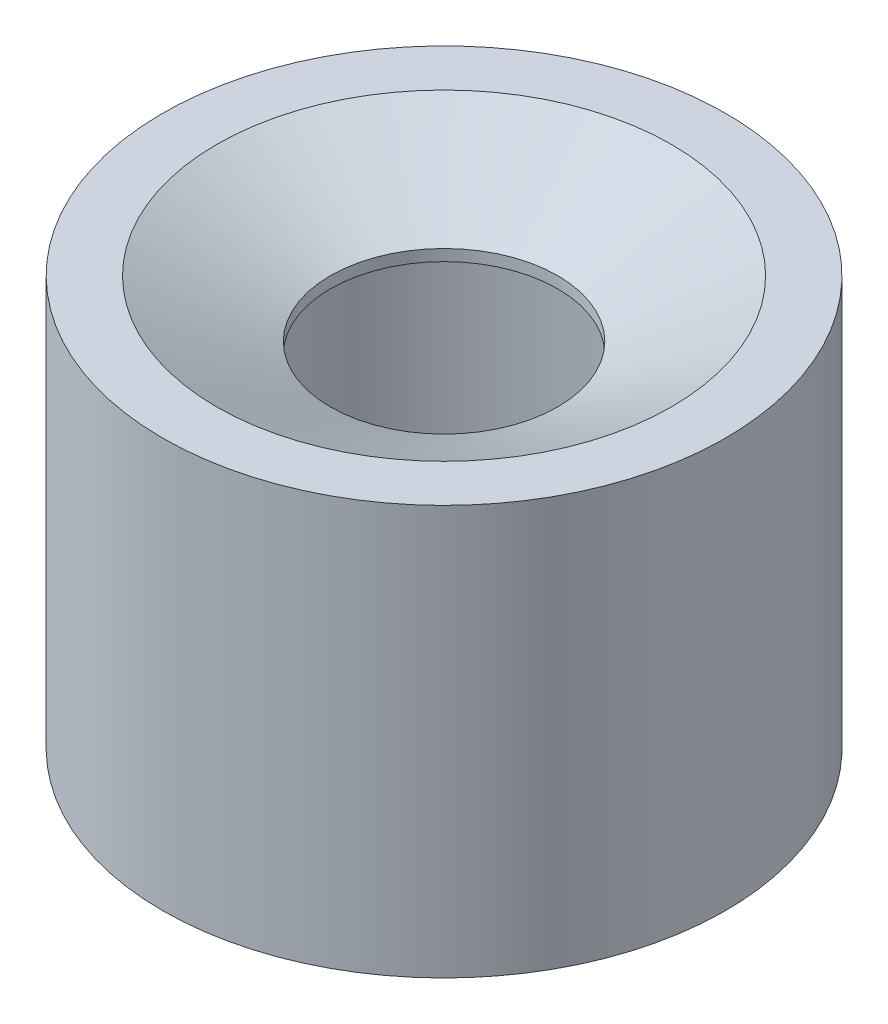
ISO-10303-21;
HEADER;
FILE_DESCRIPTION(('STEP AP214'),'2;1');
FILE_NAME('part.step','',(''),(''),'','','');
FILE_SCHEMA(('AUTOMOTIVE_DESIGN { 1 0 10303 214 1 1 1 1 }'));
ENDSEC;
DATA;
#1=APPLICATION_CONTEXT('core data for automotive mechanical design processes');
#2=APPLICATION_PROTOCOL_DEFINITION('international standard','automotive_design',2000,#1);
#3=PRODUCT_CONTEXT('',#1,'mechanical');
#4=PRODUCT('Part','Part','',(#3));
#5=PRODUCT_RELATED_PRODUCT_CATEGORY('part','',(#4));
#6=PRODUCT_DEFINITION_FORMATION('','',#4);
#7=PRODUCT_DEFINITION_CONTEXT('part definition',#1,'design');
#8=PRODUCT_DEFINITION('design','',#6,#7);
#9=PRODUCT_DEFINITION_SHAPE('','',#8);
#10=(LENGTH_UNIT() NAMED_UNIT(*) SI_UNIT(.MILLI.,.METRE.));
#11=(NAMED_UNIT(*) PLANE_ANGLE_UNIT() SI_UNIT($,.RADIAN.));
#12=(NAMED_UNIT(*) SI_UNIT($,.STERADIAN.) SOLID_ANGLE_UNIT());
#13=UNCERTAINTY_MEASURE_WITH_UNIT(LENGTH_MEASURE(1.E-05),#10,'distance_accuracy_value','');
#14=(GEOMETRIC_REPRESENTATION_CONTEXT(3) GLOBAL_UNCERTAINTY_ASSIGNED_CONTEXT((#13)) GLOBAL_UNIT_ASSIGNED_CONTEXT((#10,
#11,#12)) REPRESENTATION_CONTEXT('',''));
#15=CARTESIAN_POINT('',(0.,0.,0.));
#16=DIRECTION('',(0.,0.,1.));
#17=DIRECTION('',(1.,0.,0.));
#18=AXIS2_PLACEMENT_3D('',#15,#16,#17);
#19=CARTESIAN_POINT('',(0.,0.,0.));
#20=DIRECTION('',(0.,1.,0.));
#21=DIRECTION('',(0.,0.,1.));
#22=AXIS2_PLACEMENT_3D('',#19,#20,#21);
#23=PLANE('',#22);
#24=CARTESIAN_POINT('',(0.,0.,0.));
#25=DIRECTION('',(0.,1.,0.));
#26=DIRECTION('',(0.,0.,1.));
#27=AXIS2_PLACEMENT_3D('',#24,#25,#26);
#28=CIRCLE('',#27,2.475);
#29=CARTESIAN_POINT('',(0.,0.,2.475));
#30=VERTEX_POINT('',#29);
#31=EDGE_CURVE('E45',#30,#30,#28,.T.);
#32=ORIENTED_EDGE('',*,*,#31,.F.);
#33=EDGE_LOOP('',(#32));
#34=FACE_BOUND('',#33,.T.);
#35=CARTESIAN_POINT('',(0.,0.,0.));
#36=DIRECTION('',(0.,1.,0.));
#37=DIRECTION('',(0.,0.,1.));
#38=AXIS2_PLACEMENT_3D('',#35,#36,#37);
#39=CIRCLE('',#38,1.975);
#40=CARTESIAN_POINT('',(0.,0.,1.975));
#41=VERTEX_POINT('',#40);
#42=EDGE_CURVE('E49',#41,#41,#39,.T.);
#43=ORIENTED_EDGE('',*,*,#42,.T.);
#44=EDGE_LOOP('',(#43));
#45=FACE_BOUND('',#44,.T.);
#46=ADVANCED_FACE('F33',(#34,#45),#23,.F.);
#47=CARTESIAN_POINT('',(0.,3.,0.));
#48=DIRECTION('',(0.,-1.,0.));
#49=DIRECTION('',(0.,0.,-1.));
#50=AXIS2_PLACEMENT_3D('',#47,#48,#49);
#51=CYLINDRICAL_SURFACE('',#50,2.475);
#52=ORIENTED_EDGE('',*,*,#31,.T.);
#53=EDGE_LOOP('',(#52));
#54=FACE_BOUND('',#53,.T.);
#55=CARTESIAN_POINT('',(0.,3.6,0.));
#56=DIRECTION('',(0.,1.,0.));
#57=DIRECTION('',(0.,0.,1.));
#58=AXIS2_PLACEMENT_3D('',#55,#56,#57);
#59=CIRCLE('',#58,2.475);
#60=CARTESIAN_POINT('',(0.,3.6,2.475));
#61=VERTEX_POINT('',#60);
#62=EDGE_CURVE('E57',#61,#61,#59,.T.);
#63=ORIENTED_EDGE('',*,*,#62,.F.);
#64=EDGE_LOOP('',(#63));
#65=FACE_BOUND('',#64,.T.);
#66=ADVANCED_FACE('F78',(#54,#65),#51,.T.);
#67=CARTESIAN_POINT('',(0.,3.,0.));
#68=DIRECTION('',(0.,-1.,0.));
#69=DIRECTION('',(0.,0.,-1.));
#70=AXIS2_PLACEMENT_3D('',#67,#68,#69);
#71=CYLINDRICAL_SURFACE('',#70,1.975);
#72=CARTESIAN_POINT('',(0.,3.,0.));
#73=DIRECTION('',(0.,1.,0.));
#74=DIRECTION('',(0.,0.,1.));
#75=AXIS2_PLACEMENT_3D('',#72,#73,#74);
#76=CIRCLE('',#75,1.975);
#77=CARTESIAN_POINT('',(0.,3.,1.975));
#78=VERTEX_POINT('',#77);
#79=EDGE_CURVE('E54',#78,#78,#76,.T.);
#80=ORIENTED_EDGE('',*,*,#79,.T.);
#81=EDGE_LOOP('',(#80));
#82=FACE_BOUND('',#81,.T.);
#83=ORIENTED_EDGE('',*,*,#42,.F.);
#84=EDGE_LOOP('',(#83));
#85=FACE_BOUND('',#84,.T.);
#86=ADVANCED_FACE('F84',(#82,#85),#71,.F.);
#87=CARTESIAN_POINT('',(0.,3.,0.));
#88=DIRECTION('',(0.,1.,0.));
#89=DIRECTION('',(0.,0.,1.));
#90=AXIS2_PLACEMENT_3D('',#87,#88,#89);
#91=PLANE('',#90);
#92=CARTESIAN_POINT('',(0.,3.,0.));
#93=DIRECTION('',(0.,1.,0.));
#94=DIRECTION('',(0.,0.,1.));
#95=AXIS2_PLACEMENT_3D('',#92,#93,#94);
#96=CIRCLE('',#95,1.);
#97=CARTESIAN_POINT('',(0.,3.,1.));
#98=VERTEX_POINT('',#97);
#99=EDGE_CURVE('E60',#98,#98,#96,.T.);
#100=ORIENTED_EDGE('',*,*,#99,.T.);
#101=EDGE_LOOP('',(#100));
#102=FACE_BOUND('',#101,.T.);
#103=ORIENTED_EDGE('',*,*,#79,.F.);
#104=EDGE_LOOP('',(#103));
#105=FACE_BOUND('',#104,.T.);
#106=ADVANCED_FACE('F64',(#102,#105),#91,.F.);
#107=CARTESIAN_POINT('',(0.,3.6,0.));
#108=DIRECTION('',(0.,1.,0.));
#109=DIRECTION('',(0.,0.,1.));
#110=AXIS2_PLACEMENT_3D('',#107,#108,#109);
#111=PLANE('',#110);
#112=CARTESIAN_POINT('',(0.,3.6,0.));
#113=DIRECTION('',(0.,1.,0.));
#114=DIRECTION('',(0.,0.,1.));
#115=AXIS2_PLACEMENT_3D('',#112,#113,#114);
#116=CIRCLE('',#115,2.00000000000001);
#117=CARTESIAN_POINT('',(0.,3.6,2.00000000000001));
#118=VERTEX_POINT('',#117);
#119=EDGE_CURVE('E10',#118,#118,#116,.F.);
#120=ORIENTED_EDGE('',*,*,#119,.T.);
#121=EDGE_LOOP('',(#120));
#122=FACE_BOUND('',#121,.T.);
#123=ORIENTED_EDGE('',*,*,#62,.T.);
#124=EDGE_LOOP('',(#123));
#125=FACE_BOUND('',#124,.T.);
#126=ADVANCED_FACE('F69',(#122,#125),#111,.T.);
#127=CARTESIAN_POINT('',(0.,3.6,0.));
#128=DIRECTION('',(0.,-1.,0.));
#129=DIRECTION('',(0.,0.,-1.));
#130=AXIS2_PLACEMENT_3D('',#127,#128,#129);
#131=CYLINDRICAL_SURFACE('',#130,1.);
#132=CARTESIAN_POINT('',(0.,3.1,0.));
#133=DIRECTION('',(0.,1.,0.));
#134=DIRECTION('',(0.,0.,1.));
#135=AXIS2_PLACEMENT_3D('',#132,#133,#134);
#136=CIRCLE('',#135,1.);
#137=CARTESIAN_POINT('',(0.,3.1,1.));
#138=VERTEX_POINT('',#137);
#139=EDGE_CURVE('E41',#138,#138,#136,.T.);
#140=ORIENTED_EDGE('',*,*,#139,.T.);
#141=EDGE_LOOP('',(#140));
#142=FACE_BOUND('',#141,.T.);
#143=ORIENTED_EDGE('',*,*,#99,.F.);
#144=EDGE_LOOP('',(#143));
#145=FACE_BOUND('',#144,.T.);
#146=ADVANCED_FACE('F67',(#142,#145),#131,.F.);
#147=CARTESIAN_POINT('',(0.,3.1,0.));
#148=DIRECTION('',(0.,1.,0.));
#149=DIRECTION('',(0.,0.,1.));
#150=AXIS2_PLACEMENT_3D('',#147,#148,#149);
#151=CONICAL_SURFACE('',#150,1.,1.10714871779409);
#152=ORIENTED_EDGE('',*,*,#119,.F.);
#153=EDGE_LOOP('',(#152));
#154=FACE_BOUND('',#153,.T.);
#155=ORIENTED_EDGE('',*,*,#139,.F.);
#156=EDGE_LOOP('',(#155));
#157=FACE_BOUND('',#156,.T.);
#158=ADVANCED_FACE('F36',(#154,#157),#151,.F.);
#159=CLOSED_SHELL('',(#46,#66,#86,#106,#126,#146,#158));
#160=MANIFOLD_SOLID_BREP('B2',#159);
#161=ADVANCED_BREP_SHAPE_REPRESENTATION('',(#18,#160),#14);
#162=SHAPE_DEFINITION_REPRESENTATION(#9,#161);
ENDSEC;
END-ISO-10303-21;
